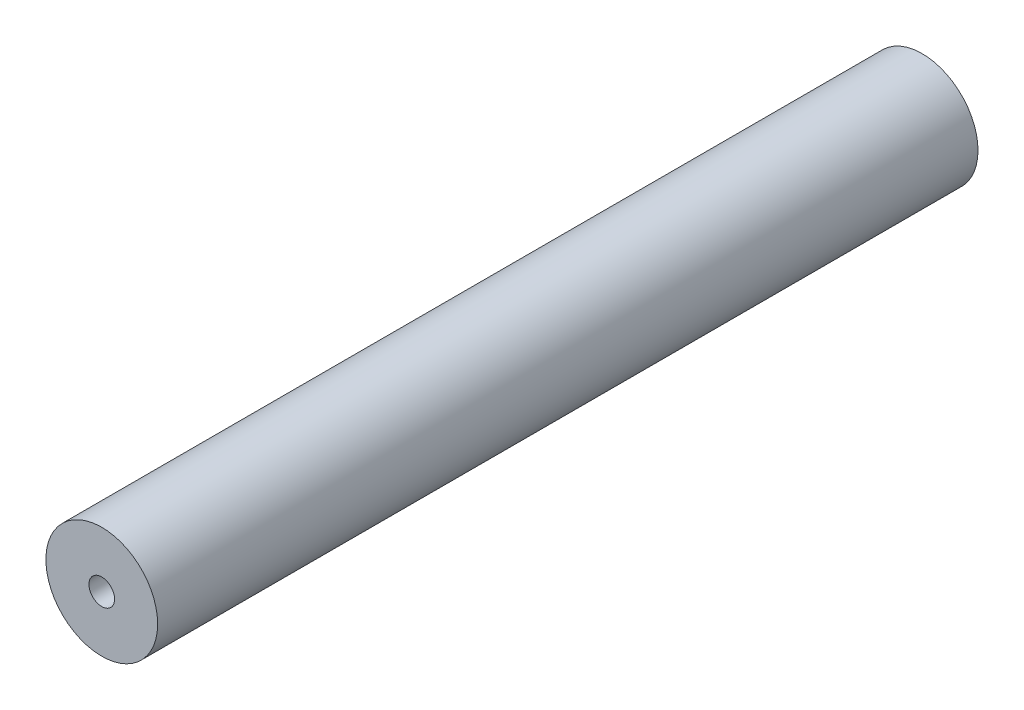
ISO-10303-21;
HEADER;
FILE_DESCRIPTION(('STEP AP214'),'2;1');
FILE_NAME('part.step','',(''),(''),'','','');
FILE_SCHEMA(('AUTOMOTIVE_DESIGN { 1 0 10303 214 1 1 1 1 }'));
ENDSEC;
DATA;
#1=APPLICATION_CONTEXT('core data for automotive mechanical design processes');
#2=APPLICATION_PROTOCOL_DEFINITION('international standard','automotive_design',2000,#1);
#3=PRODUCT_CONTEXT('',#1,'mechanical');
#4=PRODUCT('Part','Part','',(#3));
#5=PRODUCT_RELATED_PRODUCT_CATEGORY('part','',(#4));
#6=PRODUCT_DEFINITION_FORMATION('','',#4);
#7=PRODUCT_DEFINITION_CONTEXT('part definition',#1,'design');
#8=PRODUCT_DEFINITION('design','',#6,#7);
#9=PRODUCT_DEFINITION_SHAPE('','',#8);
#10=(LENGTH_UNIT() NAMED_UNIT(*) SI_UNIT(.MILLI.,.METRE.));
#11=(NAMED_UNIT(*) PLANE_ANGLE_UNIT() SI_UNIT($,.RADIAN.));
#12=(NAMED_UNIT(*) SI_UNIT($,.STERADIAN.) SOLID_ANGLE_UNIT());
#13=UNCERTAINTY_MEASURE_WITH_UNIT(LENGTH_MEASURE(1.E-05),#10,'distance_accuracy_value','');
#14=(GEOMETRIC_REPRESENTATION_CONTEXT(3) GLOBAL_UNCERTAINTY_ASSIGNED_CONTEXT((#13)) GLOBAL_UNIT_ASSIGNED_CONTEXT((#10,
#11,#12)) REPRESENTATION_CONTEXT('',''));
#15=CARTESIAN_POINT('',(0.,0.,0.));
#16=DIRECTION('',(0.,0.,1.));
#17=DIRECTION('',(1.,0.,0.));
#18=AXIS2_PLACEMENT_3D('',#15,#16,#17);
#19=CARTESIAN_POINT('',(0.,0.,203.2));
#20=DIRECTION('',(0.,0.,-1.));
#21=DIRECTION('',(-1.,0.,0.));
#22=AXIS2_PLACEMENT_3D('',#19,#20,#21);
#23=CYLINDRICAL_SURFACE('',#22,13.8390186531875);
#24=CARTESIAN_POINT('',(0.,0.,203.2));
#25=DIRECTION('',(0.,0.,1.));
#26=DIRECTION('',(1.,0.,0.));
#27=AXIS2_PLACEMENT_3D('',#24,#25,#26);
#28=CIRCLE('',#27,13.8390186531875);
#29=CARTESIAN_POINT('',(13.8390186531875,0.,203.2));
#30=VERTEX_POINT('',#29);
#31=EDGE_CURVE('E10',#30,#30,#28,.T.);
#32=ORIENTED_EDGE('',*,*,#31,.F.);
#33=EDGE_LOOP('',(#32));
#34=FACE_BOUND('',#33,.T.);
#35=CARTESIAN_POINT('',(0.,0.,0.));
#36=DIRECTION('',(0.,0.,1.));
#37=DIRECTION('',(1.,0.,0.));
#38=AXIS2_PLACEMENT_3D('',#35,#36,#37);
#39=CIRCLE('',#38,13.8390186531875);
#40=CARTESIAN_POINT('',(13.8390186531875,0.,0.));
#41=VERTEX_POINT('',#40);
#42=EDGE_CURVE('E39',#41,#41,#39,.T.);
#43=ORIENTED_EDGE('',*,*,#42,.T.);
#44=EDGE_LOOP('',(#43));
#45=FACE_BOUND('',#44,.T.);
#46=ADVANCED_FACE('F36',(#34,#45),#23,.T.);
#47=CARTESIAN_POINT('',(0.,0.,203.2));
#48=DIRECTION('',(0.,0.,1.));
#49=DIRECTION('',(1.,0.,0.));
#50=AXIS2_PLACEMENT_3D('',#47,#48,#49);
#51=PLANE('',#50);
#52=CARTESIAN_POINT('',(0.,0.,203.2));
#53=DIRECTION('',(0.,0.,1.));
#54=DIRECTION('',(1.,0.,0.));
#55=AXIS2_PLACEMENT_3D('',#52,#53,#54);
#56=CIRCLE('',#55,3.17499999999999);
#57=CARTESIAN_POINT('',(3.17499999999999,0.,203.2));
#58=VERTEX_POINT('',#57);
#59=EDGE_CURVE('E53',#58,#58,#56,.T.);
#60=ORIENTED_EDGE('',*,*,#59,.F.);
#61=EDGE_LOOP('',(#60));
#62=FACE_BOUND('',#61,.T.);
#63=ORIENTED_EDGE('',*,*,#31,.T.);
#64=EDGE_LOOP('',(#63));
#65=FACE_BOUND('',#64,.T.);
#66=ADVANCED_FACE('F60',(#62,#65),#51,.T.);
#67=CARTESIAN_POINT('',(0.,0.,0.));
#68=DIRECTION('',(0.,0.,1.));
#69=DIRECTION('',(1.,0.,0.));
#70=AXIS2_PLACEMENT_3D('',#67,#68,#69);
#71=PLANE('',#70);
#72=CARTESIAN_POINT('',(0.,0.,0.));
#73=DIRECTION('',(0.,0.,1.));
#74=DIRECTION('',(1.,0.,0.));
#75=AXIS2_PLACEMENT_3D('',#72,#73,#74);
#76=CIRCLE('',#75,3.17499999999997);
#77=CARTESIAN_POINT('',(3.17499999999997,0.,0.));
#78=VERTEX_POINT('',#77);
#79=EDGE_CURVE('E48',#78,#78,#76,.T.);
#80=ORIENTED_EDGE('',*,*,#79,.T.);
#81=EDGE_LOOP('',(#80));
#82=FACE_BOUND('',#81,.T.);
#83=ORIENTED_EDGE('',*,*,#42,.F.);
#84=EDGE_LOOP('',(#83));
#85=FACE_BOUND('',#84,.T.);
#86=ADVANCED_FACE('F62',(#82,#85),#71,.F.);
#87=CARTESIAN_POINT('',(0.,0.,203.2));
#88=DIRECTION('',(0.,0.,1.));
#89=DIRECTION('',(1.,0.,0.));
#90=AXIS2_PLACEMENT_3D('',#87,#88,#89);
#91=CYLINDRICAL_SURFACE('',#90,3.17499999999998);
#92=ORIENTED_EDGE('',*,*,#79,.F.);
#93=EDGE_LOOP('',(#92));
#94=FACE_BOUND('',#93,.T.);
#95=ORIENTED_EDGE('',*,*,#59,.T.);
#96=EDGE_LOOP('',(#95));
#97=FACE_BOUND('',#96,.T.);
#98=ADVANCED_FACE('F58',(#94,#97),#91,.F.);
#99=CLOSED_SHELL('',(#46,#66,#86,#98));
#100=MANIFOLD_SOLID_BREP('B2',#99);
#101=ADVANCED_BREP_SHAPE_REPRESENTATION('',(#18,#100),#14);
#102=SHAPE_DEFINITION_REPRESENTATION(#9,#101);
ENDSEC;
END-ISO-10303-21;
